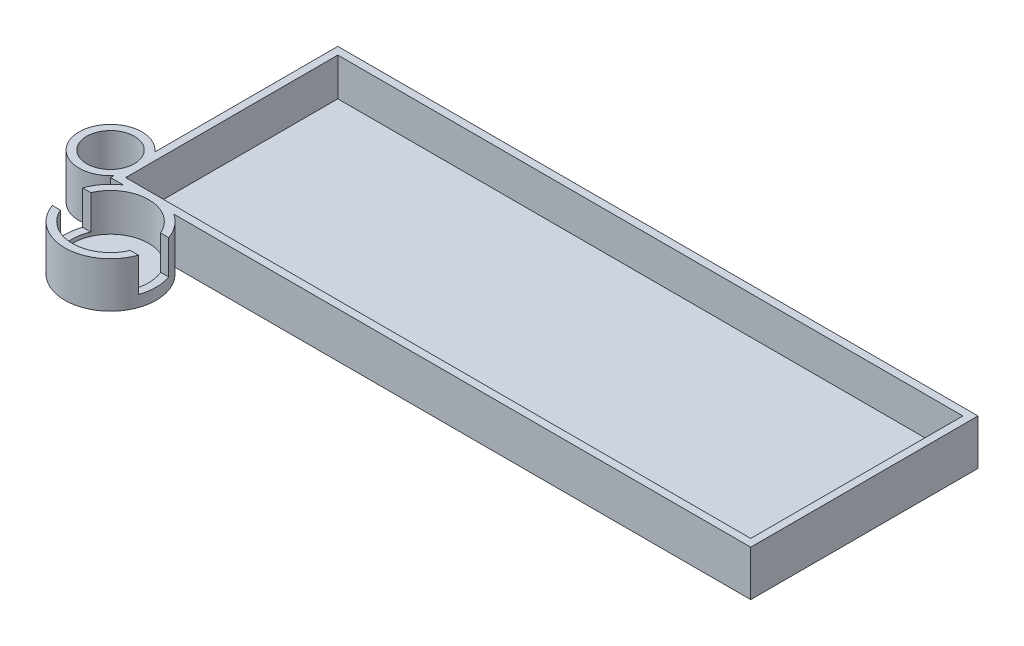
ISO-10303-21;
HEADER;
FILE_DESCRIPTION(('STEP AP214'),'2;1');
FILE_NAME('part.step','',(''),(''),'','','');
FILE_SCHEMA(('AUTOMOTIVE_DESIGN { 1 0 10303 214 1 1 1 1 }'));
ENDSEC;
DATA;
#1=APPLICATION_CONTEXT('core data for automotive mechanical design processes');
#2=APPLICATION_PROTOCOL_DEFINITION('international standard','automotive_design',2000,#1);
#3=PRODUCT_CONTEXT('',#1,'mechanical');
#4=PRODUCT('Part','Part','',(#3));
#5=PRODUCT_RELATED_PRODUCT_CATEGORY('part','',(#4));
#6=PRODUCT_DEFINITION_FORMATION('','',#4);
#7=PRODUCT_DEFINITION_CONTEXT('part definition',#1,'design');
#8=PRODUCT_DEFINITION('design','',#6,#7);
#9=PRODUCT_DEFINITION_SHAPE('','',#8);
#10=(LENGTH_UNIT() NAMED_UNIT(*) SI_UNIT(.MILLI.,.METRE.));
#11=(NAMED_UNIT(*) PLANE_ANGLE_UNIT() SI_UNIT($,.RADIAN.));
#12=(NAMED_UNIT(*) SI_UNIT($,.STERADIAN.) SOLID_ANGLE_UNIT());
#13=UNCERTAINTY_MEASURE_WITH_UNIT(LENGTH_MEASURE(1.E-05),#10,'distance_accuracy_value','');
#14=(GEOMETRIC_REPRESENTATION_CONTEXT(3) GLOBAL_UNCERTAINTY_ASSIGNED_CONTEXT((#13)) GLOBAL_UNIT_ASSIGNED_CONTEXT((#10,
#11,#12)) REPRESENTATION_CONTEXT('',''));
#15=CARTESIAN_POINT('',(0.,0.,0.));
#16=DIRECTION('',(0.,0.,1.));
#17=DIRECTION('',(1.,0.,0.));
#18=AXIS2_PLACEMENT_3D('',#15,#16,#17);
#19=CARTESIAN_POINT('',(-8.29999999999999,12.,51.7));
#20=DIRECTION('',(0.,-1.,0.));
#21=DIRECTION('',(0.,0.,-1.));
#22=AXIS2_PLACEMENT_3D('',#19,#20,#21);
#23=CYLINDRICAL_SURFACE('',#22,6.3);
#24=CARTESIAN_POINT('',(-8.29999999999999,12.,51.7));
#25=DIRECTION('',(0.,-1.,0.));
#26=DIRECTION('',(0.,0.,-1.));
#27=AXIS2_PLACEMENT_3D('',#24,#25,#26);
#28=CIRCLE('',#27,6.3);
#29=CARTESIAN_POINT('',(-8.29999999999999,12.,45.4));
#30=VERTEX_POINT('',#29);
#31=EDGE_CURVE('E194',#30,#30,#28,.T.);
#32=ORIENTED_EDGE('',*,*,#31,.F.);
#33=EDGE_LOOP('',(#32));
#34=FACE_BOUND('',#33,.T.);
#35=CARTESIAN_POINT('',(-8.29999999999999,2.,51.7));
#36=DIRECTION('',(0.,-1.,0.));
#37=DIRECTION('',(0.,0.,-1.));
#38=AXIS2_PLACEMENT_3D('',#35,#36,#37);
#39=CIRCLE('',#38,6.3);
#40=CARTESIAN_POINT('',(-8.29999999999999,2.,45.4));
#41=VERTEX_POINT('',#40);
#42=EDGE_CURVE('E11',#41,#41,#39,.F.);
#43=ORIENTED_EDGE('',*,*,#42,.F.);
#44=EDGE_LOOP('',(#43));
#45=FACE_BOUND('',#44,.T.);
#46=ADVANCED_FACE('F45',(#34,#45),#23,.F.);
#47=CARTESIAN_POINT('',(-1.99999999999999,12.,58.));
#48=DIRECTION('',(-1.,0.,0.));
#49=DIRECTION('',(0.,0.,1.));
#50=AXIS2_PLACEMENT_3D('',#47,#48,#49);
#51=PLANE('',#50);
#52=DIRECTION('',(0.,-1.,0.));
#53=VECTOR('',#52,1.);
#54=CARTESIAN_POINT('',(-1.99999999999999,12.,46.2962975655575));
#55=LINE('',#54,#53);
#56=CARTESIAN_POINT('',(-1.99999999999999,12.,46.2962975655575));
#57=VERTEX_POINT('',#56);
#58=CARTESIAN_POINT('',(-1.99999999999999,0.,46.2962975655575));
#59=VERTEX_POINT('',#58);
#60=EDGE_CURVE('E185',#57,#59,#55,.T.);
#61=ORIENTED_EDGE('',*,*,#60,.F.);
#62=DIRECTION('',(0.,0.,-1.));
#63=VECTOR('',#62,1.);
#64=CARTESIAN_POINT('',(-1.99999999999999,12.,58.));
#65=LINE('',#64,#63);
#66=CARTESIAN_POINT('',(-1.99999999999999,12.,-2.));
#67=VERTEX_POINT('',#66);
#68=EDGE_CURVE('E200',#57,#67,#65,.T.);
#69=ORIENTED_EDGE('',*,*,#68,.T.);
#70=DIRECTION('',(0.,-1.,0.));
#71=VECTOR('',#70,1.);
#72=CARTESIAN_POINT('',(-1.99999999999999,12.,-2.));
#73=LINE('',#72,#71);
#74=CARTESIAN_POINT('',(-1.99999999999999,0.,-2.));
#75=VERTEX_POINT('',#74);
#76=EDGE_CURVE('E253',#67,#75,#73,.T.);
#77=ORIENTED_EDGE('',*,*,#76,.T.);
#78=DIRECTION('',(0.,0.,-1.));
#79=VECTOR('',#78,1.);
#80=CARTESIAN_POINT('',(-1.99999999999999,0.,58.));
#81=LINE('',#80,#79);
#82=EDGE_CURVE('E202',#59,#75,#81,.T.);
#83=ORIENTED_EDGE('',*,*,#82,.F.);
#84=EDGE_LOOP('',(#61,#69,#77,#83));
#85=FACE_BOUND('',#84,.T.);
#86=ADVANCED_FACE('F198',(#85),#51,.T.);
#87=CARTESIAN_POINT('',(0.,12.,0.));
#88=DIRECTION('',(0.,1.,0.));
#89=DIRECTION('',(0.,0.,1.));
#90=AXIS2_PLACEMENT_3D('',#87,#88,#89);
#91=PLANE('',#90);
#92=DIRECTION('',(1.,0.,0.));
#93=VECTOR('',#92,1.);
#94=CARTESIAN_POINT('',(31.2664857365085,12.,72.05));
#95=LINE('',#94,#93);
#96=CARTESIAN_POINT('',(-3.31672776132163,12.,72.05));
#97=VERTEX_POINT('',#96);
#98=CARTESIAN_POINT('',(-1.1696800378321,12.,72.05));
#99=VERTEX_POINT('',#98);
#100=EDGE_CURVE('E295',#97,#99,#95,.T.);
#101=ORIENTED_EDGE('',*,*,#100,.F.);
#102=CARTESIAN_POINT('',(8.05000000000001,12.,68.05));
#103=DIRECTION('',(0.,-1.,0.));
#104=DIRECTION('',(0.,0.,-1.));
#105=AXIS2_PLACEMENT_3D('',#102,#103,#104);
#106=CIRCLE('',#105,12.05);
#107=CARTESIAN_POINT('',(19.4167277613216,12.,72.05));
#108=VERTEX_POINT('',#107);
#109=EDGE_CURVE('E307',#108,#97,#106,.T.);
#110=ORIENTED_EDGE('',*,*,#109,.F.);
#111=CARTESIAN_POINT('',(17.2696800378321,12.,72.05));
#112=VERTEX_POINT('',#111);
#113=EDGE_CURVE('E311',#112,#108,#95,.T.);
#114=ORIENTED_EDGE('',*,*,#113,.F.);
#115=CARTESIAN_POINT('',(8.05000000000001,12.,68.05));
#116=DIRECTION('',(0.,-1.,0.));
#117=DIRECTION('',(0.,0.,-1.));
#118=AXIS2_PLACEMENT_3D('',#115,#116,#117);
#119=CIRCLE('',#118,10.05);
#120=EDGE_CURVE('E309',#112,#99,#119,.T.);
#121=ORIENTED_EDGE('',*,*,#120,.T.);
#122=EDGE_LOOP('',(#101,#110,#114,#121));
#123=FACE_BOUND('',#122,.T.);
#124=ADVANCED_FACE('F305',(#123),#91,.T.);
#125=CARTESIAN_POINT('',(8.05000000000001,12.,68.05));
#126=DIRECTION('',(0.,-1.,0.));
#127=DIRECTION('',(0.,0.,-1.));
#128=AXIS2_PLACEMENT_3D('',#125,#126,#127);
#129=CYLINDRICAL_SURFACE('',#128,10.05);
#130=CARTESIAN_POINT('',(8.05000000000001,3.,68.05));
#131=DIRECTION('',(0.,1.,0.));
#132=DIRECTION('',(0.,0.,1.));
#133=AXIS2_PLACEMENT_3D('',#130,#131,#132);
#134=CIRCLE('',#133,10.05);
#135=CARTESIAN_POINT('',(-1.1696800378321,3.,72.05));
#136=VERTEX_POINT('',#135);
#137=CARTESIAN_POINT('',(-1.16968003783211,3.,64.05));
#138=VERTEX_POINT('',#137);
#139=EDGE_CURVE('E466',#136,#138,#134,.F.);
#140=ORIENTED_EDGE('',*,*,#139,.F.);
#141=DIRECTION('',(0.,-1.,0.));
#142=VECTOR('',#141,1.);
#143=CARTESIAN_POINT('',(-1.1696800378321,12.,72.05));
#144=LINE('',#143,#142);
#145=EDGE_CURVE('E478',#136,#99,#144,.F.);
#146=ORIENTED_EDGE('',*,*,#145,.T.);
#147=ORIENTED_EDGE('',*,*,#120,.F.);
#148=DIRECTION('',(0.,-1.,0.));
#149=VECTOR('',#148,1.);
#150=CARTESIAN_POINT('',(17.2696800378321,12.,72.05));
#151=LINE('',#150,#149);
#152=CARTESIAN_POINT('',(17.2696800378321,3.,72.05));
#153=VERTEX_POINT('',#152);
#154=EDGE_CURVE('E475',#112,#153,#151,.T.);
#155=ORIENTED_EDGE('',*,*,#154,.T.);
#156=CARTESIAN_POINT('',(17.2696800378321,3.,64.05));
#157=VERTEX_POINT('',#156);
#158=EDGE_CURVE('E463',#157,#153,#134,.F.);
#159=ORIENTED_EDGE('',*,*,#158,.F.);
#160=DIRECTION('',(0.,-1.,0.));
#161=VECTOR('',#160,1.);
#162=CARTESIAN_POINT('',(17.2696800378321,12.,64.05));
#163=LINE('',#162,#161);
#164=CARTESIAN_POINT('',(17.2696800378321,12.,64.05));
#165=VERTEX_POINT('',#164);
#166=EDGE_CURVE('E471',#157,#165,#163,.F.);
#167=ORIENTED_EDGE('',*,*,#166,.T.);
#168=CARTESIAN_POINT('',(-1.16968003783211,12.,64.05));
#169=VERTEX_POINT('',#168);
#170=EDGE_CURVE('E326',#169,#165,#119,.T.);
#171=ORIENTED_EDGE('',*,*,#170,.F.);
#172=DIRECTION('',(0.,-1.,0.));
#173=VECTOR('',#172,1.);
#174=CARTESIAN_POINT('',(-1.16968003783211,12.,64.05));
#175=LINE('',#174,#173);
#176=EDGE_CURVE('E467',#169,#138,#175,.T.);
#177=ORIENTED_EDGE('',*,*,#176,.T.);
#178=EDGE_LOOP('',(#140,#146,#147,#155,#159,#167,#171,#177));
#179=FACE_BOUND('',#178,.T.);
#180=CARTESIAN_POINT('',(8.05000000000001,2.,68.05));
#181=DIRECTION('',(0.,-1.,0.));
#182=DIRECTION('',(0.,0.,-1.));
#183=AXIS2_PLACEMENT_3D('',#180,#181,#182);
#184=CIRCLE('',#183,10.05);
#185=CARTESIAN_POINT('',(8.05000000000001,2.,58.));
#186=VERTEX_POINT('',#185);
#187=EDGE_CURVE('E272',#186,#186,#184,.F.);
#188=ORIENTED_EDGE('',*,*,#187,.F.);
#189=EDGE_LOOP('',(#188));
#190=FACE_BOUND('',#189,.T.);
#191=ADVANCED_FACE('F398',(#179,#190),#129,.F.);
#192=CARTESIAN_POINT('',(-1.99999999999999,12.,58.));
#193=DIRECTION('',(0.,0.,1.));
#194=DIRECTION('',(1.,0.,0.));
#195=AXIS2_PLACEMENT_3D('',#192,#193,#194);
#196=PLANE('',#195);
#197=DIRECTION('',(0.,-1.,0.));
#198=VECTOR('',#197,1.);
#199=CARTESIAN_POINT('',(14.6983080554379,12.,58.));
#200=LINE('',#199,#198);
#201=CARTESIAN_POINT('',(14.6983080554379,0.,58.));
#202=VERTEX_POINT('',#201);
#203=CARTESIAN_POINT('',(14.6983080554379,12.,58.));
#204=VERTEX_POINT('',#203);
#205=EDGE_CURVE('E322',#202,#204,#200,.F.);
#206=ORIENTED_EDGE('',*,*,#205,.F.);
#207=DIRECTION('',(-1.,0.,0.));
#208=VECTOR('',#207,1.);
#209=CARTESIAN_POINT('',(-1.99999999999999,0.,58.));
#210=LINE('',#209,#208);
#211=CARTESIAN_POINT('',(167.,0.,58.));
#212=VERTEX_POINT('',#211);
#213=EDGE_CURVE('E229',#212,#202,#210,.T.);
#214=ORIENTED_EDGE('',*,*,#213,.F.);
#215=DIRECTION('',(0.,-1.,0.));
#216=VECTOR('',#215,1.);
#217=CARTESIAN_POINT('',(167.,12.,58.));
#218=LINE('',#217,#216);
#219=CARTESIAN_POINT('',(167.,12.,58.));
#220=VERTEX_POINT('',#219);
#221=EDGE_CURVE('E246',#220,#212,#218,.T.);
#222=ORIENTED_EDGE('',*,*,#221,.F.);
#223=DIRECTION('',(-1.,0.,0.));
#224=VECTOR('',#223,1.);
#225=CARTESIAN_POINT('',(-1.99999999999999,12.,58.));
#226=LINE('',#225,#224);
#227=EDGE_CURVE('E213',#220,#204,#226,.T.);
#228=ORIENTED_EDGE('',*,*,#227,.T.);
#229=EDGE_LOOP('',(#206,#214,#222,#228));
#230=FACE_BOUND('',#229,.T.);
#231=ADVANCED_FACE('F428',(#230),#196,.T.);
#232=CARTESIAN_POINT('',(0.,2.,0.));
#233=DIRECTION('',(0.,1.,0.));
#234=DIRECTION('',(0.,0.,1.));
#235=AXIS2_PLACEMENT_3D('',#232,#233,#234);
#236=PLANE('',#235);
#237=DIRECTION('',(0.,0.,1.));
#238=VECTOR('',#237,1.);
#239=CARTESIAN_POINT('',(0.,2.,0.));
#240=LINE('',#239,#238);
#241=CARTESIAN_POINT('',(0.,2.,0.));
#242=VERTEX_POINT('',#241);
#243=CARTESIAN_POINT('',(0.,2.,56.));
#244=VERTEX_POINT('',#243);
#245=EDGE_CURVE('E249',#242,#244,#240,.T.);
#246=ORIENTED_EDGE('',*,*,#245,.T.);
#247=DIRECTION('',(1.,0.,0.));
#248=VECTOR('',#247,1.);
#249=CARTESIAN_POINT('',(0.,2.,56.));
#250=LINE('',#249,#248);
#251=CARTESIAN_POINT('',(165.,2.,56.));
#252=VERTEX_POINT('',#251);
#253=EDGE_CURVE('E261',#244,#252,#250,.T.);
#254=ORIENTED_EDGE('',*,*,#253,.T.);
#255=DIRECTION('',(0.,0.,-1.));
#256=VECTOR('',#255,1.);
#257=CARTESIAN_POINT('',(165.,2.,0.));
#258=LINE('',#257,#256);
#259=CARTESIAN_POINT('',(165.,2.,0.));
#260=VERTEX_POINT('',#259);
#261=EDGE_CURVE('E264',#252,#260,#258,.T.);
#262=ORIENTED_EDGE('',*,*,#261,.T.);
#263=DIRECTION('',(-1.,0.,0.));
#264=VECTOR('',#263,1.);
#265=CARTESIAN_POINT('',(0.,2.,0.));
#266=LINE('',#265,#264);
#267=EDGE_CURVE('E268',#260,#242,#266,.T.);
#268=ORIENTED_EDGE('',*,*,#267,.T.);
#269=EDGE_LOOP('',(#246,#254,#262,#268));
#270=FACE_BOUND('',#269,.T.);
#271=ADVANCED_FACE('F375',(#270),#236,.T.);
#272=DIRECTION('',(0.,-1.,0.));
#273=VECTOR('',#272,1.);
#274=CARTESIAN_POINT('',(1.40169194456213,12.,58.));
#275=LINE('',#274,#273);
#276=CARTESIAN_POINT('',(1.40169194456213,12.,58.));
#277=VERTEX_POINT('',#276);
#278=CARTESIAN_POINT('',(1.40169194456213,0.,58.));
#279=VERTEX_POINT('',#278);
#280=EDGE_CURVE('E333',#277,#279,#275,.T.);
#281=ORIENTED_EDGE('',*,*,#280,.F.);
#282=CARTESIAN_POINT('',(-1.99999999999999,12.,58.));
#283=VERTEX_POINT('',#282);
#284=EDGE_CURVE('E218',#277,#283,#226,.T.);
#285=ORIENTED_EDGE('',*,*,#284,.T.);
#286=DIRECTION('',(0.,-1.,0.));
#287=VECTOR('',#286,1.);
#288=CARTESIAN_POINT('',(-1.99999999999999,12.,58.));
#289=LINE('',#288,#287);
#290=CARTESIAN_POINT('',(-1.99999999999999,0.,58.));
#291=VERTEX_POINT('',#290);
#292=EDGE_CURVE('E228',#283,#291,#289,.T.);
#293=ORIENTED_EDGE('',*,*,#292,.T.);
#294=EDGE_CURVE('E233',#279,#291,#210,.T.);
#295=ORIENTED_EDGE('',*,*,#294,.F.);
#296=EDGE_LOOP('',(#281,#285,#293,#295));
#297=FACE_BOUND('',#296,.T.);
#298=ADVANCED_FACE('F509',(#297),#196,.T.);
#299=CARTESIAN_POINT('',(167.,12.,58.));
#300=DIRECTION('',(1.,0.,0.));
#301=DIRECTION('',(0.,0.,-1.));
#302=AXIS2_PLACEMENT_3D('',#299,#300,#301);
#303=PLANE('',#302);
#304=DIRECTION('',(0.,0.,1.));
#305=VECTOR('',#304,1.);
#306=CARTESIAN_POINT('',(167.,0.,58.));
#307=LINE('',#306,#305);
#308=CARTESIAN_POINT('',(167.,0.,-2.));
#309=VERTEX_POINT('',#308);
#310=EDGE_CURVE('E242',#309,#212,#307,.T.);
#311=ORIENTED_EDGE('',*,*,#310,.F.);
#312=DIRECTION('',(0.,-1.,0.));
#313=VECTOR('',#312,1.);
#314=CARTESIAN_POINT('',(167.,12.,-2.));
#315=LINE('',#314,#313);
#316=CARTESIAN_POINT('',(167.,12.,-2.));
#317=VERTEX_POINT('',#316);
#318=EDGE_CURVE('E250',#317,#309,#315,.T.);
#319=ORIENTED_EDGE('',*,*,#318,.F.);
#320=DIRECTION('',(0.,0.,1.));
#321=VECTOR('',#320,1.);
#322=CARTESIAN_POINT('',(167.,12.,58.));
#323=LINE('',#322,#321);
#324=EDGE_CURVE('E224',#317,#220,#323,.T.);
#325=ORIENTED_EDGE('',*,*,#324,.T.);
#326=ORIENTED_EDGE('',*,*,#221,.T.);
#327=EDGE_LOOP('',(#311,#319,#325,#326));
#328=FACE_BOUND('',#327,.T.);
#329=ADVANCED_FACE('F511',(#328),#303,.T.);
#330=CARTESIAN_POINT('',(-1.99999999999999,12.,-2.));
#331=DIRECTION('',(0.,0.,-1.));
#332=DIRECTION('',(-1.,0.,0.));
#333=AXIS2_PLACEMENT_3D('',#330,#331,#332);
#334=PLANE('',#333);
#335=DIRECTION('',(1.,0.,0.));
#336=VECTOR('',#335,1.);
#337=CARTESIAN_POINT('',(-1.99999999999999,0.,-2.));
#338=LINE('',#337,#336);
#339=EDGE_CURVE('E238',#75,#309,#338,.T.);
#340=ORIENTED_EDGE('',*,*,#339,.F.);
#341=ORIENTED_EDGE('',*,*,#76,.F.);
#342=DIRECTION('',(1.,0.,0.));
#343=VECTOR('',#342,1.);
#344=CARTESIAN_POINT('',(-1.99999999999999,12.,-2.));
#345=LINE('',#344,#343);
#346=EDGE_CURVE('E210',#67,#317,#345,.T.);
#347=ORIENTED_EDGE('',*,*,#346,.T.);
#348=ORIENTED_EDGE('',*,*,#318,.T.);
#349=EDGE_LOOP('',(#340,#341,#347,#348));
#350=FACE_BOUND('',#349,.T.);
#351=ADVANCED_FACE('F392',(#350),#334,.T.);
#352=DIRECTION('',(0.,-1.,0.));
#353=VECTOR('',#352,1.);
#354=CARTESIAN_POINT('',(-1.99999999999999,12.,57.1037024344425));
#355=LINE('',#354,#353);
#356=CARTESIAN_POINT('',(-1.99999999999999,0.,57.1037024344425));
#357=VERTEX_POINT('',#356);
#358=CARTESIAN_POINT('',(-1.99999999999999,12.,57.1037024344425));
#359=VERTEX_POINT('',#358);
#360=EDGE_CURVE('E188',#357,#359,#355,.F.);
#361=ORIENTED_EDGE('',*,*,#360,.F.);
#362=EDGE_CURVE('E234',#291,#357,#81,.T.);
#363=ORIENTED_EDGE('',*,*,#362,.F.);
#364=ORIENTED_EDGE('',*,*,#292,.F.);
#365=EDGE_CURVE('E212',#283,#359,#65,.T.);
#366=ORIENTED_EDGE('',*,*,#365,.T.);
#367=EDGE_LOOP('',(#361,#363,#364,#366));
#368=FACE_BOUND('',#367,.T.);
#369=ADVANCED_FACE('F384',(#368),#51,.T.);
#370=ORIENTED_EDGE('',*,*,#31,.T.);
#371=EDGE_LOOP('',(#370));
#372=FACE_BOUND('',#371,.T.);
#373=DIRECTION('',(0.,0.,-1.));
#374=VECTOR('',#373,1.);
#375=CARTESIAN_POINT('',(0.,12.,56.));
#376=LINE('',#375,#374);
#377=CARTESIAN_POINT('',(0.,12.,56.));
#378=VERTEX_POINT('',#377);
#379=CARTESIAN_POINT('',(0.,12.,0.));
#380=VERTEX_POINT('',#379);
#381=EDGE_CURVE('E336',#378,#380,#376,.T.);
#382=ORIENTED_EDGE('',*,*,#381,.T.);
#383=DIRECTION('',(1.,0.,0.));
#384=VECTOR('',#383,1.);
#385=CARTESIAN_POINT('',(0.,12.,0.));
#386=LINE('',#385,#384);
#387=CARTESIAN_POINT('',(165.,12.,0.));
#388=VERTEX_POINT('',#387);
#389=EDGE_CURVE('E339',#380,#388,#386,.T.);
#390=ORIENTED_EDGE('',*,*,#389,.T.);
#391=DIRECTION('',(0.,0.,1.));
#392=VECTOR('',#391,1.);
#393=CARTESIAN_POINT('',(165.,12.,56.));
#394=LINE('',#393,#392);
#395=CARTESIAN_POINT('',(165.,12.,56.));
#396=VERTEX_POINT('',#395);
#397=EDGE_CURVE('E343',#388,#396,#394,.T.);
#398=ORIENTED_EDGE('',*,*,#397,.T.);
#399=DIRECTION('',(-1.,0.,0.));
#400=VECTOR('',#399,1.);
#401=CARTESIAN_POINT('',(0.,12.,56.));
#402=LINE('',#401,#400);
#403=EDGE_CURVE('E347',#396,#378,#402,.T.);
#404=ORIENTED_EDGE('',*,*,#403,.T.);
#405=EDGE_LOOP('',(#382,#390,#398,#404));
#406=FACE_BOUND('',#405,.T.);
#407=ORIENTED_EDGE('',*,*,#68,.F.);
#408=CARTESIAN_POINT('',(-8.29999999999999,12.,51.7));
#409=DIRECTION('',(0.,-1.,0.));
#410=DIRECTION('',(0.,0.,-1.));
#411=AXIS2_PLACEMENT_3D('',#408,#409,#410);
#412=CIRCLE('',#411,8.3);
#413=EDGE_CURVE('E182',#359,#57,#412,.T.);
#414=ORIENTED_EDGE('',*,*,#413,.F.);
#415=ORIENTED_EDGE('',*,*,#365,.F.);
#416=ORIENTED_EDGE('',*,*,#284,.F.);
#417=CARTESIAN_POINT('',(-3.31672776132163,12.,64.05));
#418=VERTEX_POINT('',#417);
#419=EDGE_CURVE('E317',#418,#277,#106,.T.);
#420=ORIENTED_EDGE('',*,*,#419,.F.);
#421=DIRECTION('',(-1.,0.,0.));
#422=VECTOR('',#421,1.);
#423=CARTESIAN_POINT('',(31.2664857365085,12.,64.05));
#424=LINE('',#423,#422);
#425=EDGE_CURVE('E204',#169,#418,#424,.T.);
#426=ORIENTED_EDGE('',*,*,#425,.F.);
#427=ORIENTED_EDGE('',*,*,#170,.T.);
#428=CARTESIAN_POINT('',(19.4167277613217,12.,64.05));
#429=VERTEX_POINT('',#428);
#430=EDGE_CURVE('E460',#429,#165,#424,.T.);
#431=ORIENTED_EDGE('',*,*,#430,.F.);
#432=EDGE_CURVE('E316',#204,#429,#106,.T.);
#433=ORIENTED_EDGE('',*,*,#432,.F.);
#434=ORIENTED_EDGE('',*,*,#227,.F.);
#435=ORIENTED_EDGE('',*,*,#324,.F.);
#436=ORIENTED_EDGE('',*,*,#346,.F.);
#437=EDGE_LOOP('',(#407,#414,#415,#416,#420,#426,#427,#431,#433,#434,#435,#436));
#438=FACE_BOUND('',#437,.T.);
#439=ADVANCED_FACE('F207',(#372,#406,#438),#91,.T.);
#440=CARTESIAN_POINT('',(0.,12.,56.));
#441=DIRECTION('',(-1.,0.,0.));
#442=DIRECTION('',(0.,0.,1.));
#443=AXIS2_PLACEMENT_3D('',#440,#441,#442);
#444=PLANE('',#443);
#445=DIRECTION('',(0.,-1.,0.));
#446=VECTOR('',#445,1.);
#447=CARTESIAN_POINT('',(0.,12.,0.));
#448=LINE('',#447,#446);
#449=EDGE_CURVE('E350',#380,#242,#448,.T.);
#450=ORIENTED_EDGE('',*,*,#449,.F.);
#451=ORIENTED_EDGE('',*,*,#381,.F.);
#452=DIRECTION('',(0.,-1.,0.));
#453=VECTOR('',#452,1.);
#454=CARTESIAN_POINT('',(0.,12.,56.));
#455=LINE('',#454,#453);
#456=EDGE_CURVE('E351',#378,#244,#455,.T.);
#457=ORIENTED_EDGE('',*,*,#456,.T.);
#458=ORIENTED_EDGE('',*,*,#245,.F.);
#459=EDGE_LOOP('',(#450,#451,#457,#458));
#460=FACE_BOUND('',#459,.T.);
#461=ADVANCED_FACE('F371',(#460),#444,.F.);
#462=CARTESIAN_POINT('',(0.,12.,56.));
#463=DIRECTION('',(0.,0.,1.));
#464=DIRECTION('',(1.,0.,0.));
#465=AXIS2_PLACEMENT_3D('',#462,#463,#464);
#466=PLANE('',#465);
#467=ORIENTED_EDGE('',*,*,#456,.F.);
#468=ORIENTED_EDGE('',*,*,#403,.F.);
#469=DIRECTION('',(0.,-1.,0.));
#470=VECTOR('',#469,1.);
#471=CARTESIAN_POINT('',(165.,12.,56.));
#472=LINE('',#471,#470);
#473=EDGE_CURVE('E355',#396,#252,#472,.T.);
#474=ORIENTED_EDGE('',*,*,#473,.T.);
#475=ORIENTED_EDGE('',*,*,#253,.F.);
#476=EDGE_LOOP('',(#467,#468,#474,#475));
#477=FACE_BOUND('',#476,.T.);
#478=ADVANCED_FACE('F381',(#477),#466,.F.);
#479=CARTESIAN_POINT('',(165.,12.,56.));
#480=DIRECTION('',(1.,0.,0.));
#481=DIRECTION('',(0.,0.,-1.));
#482=AXIS2_PLACEMENT_3D('',#479,#480,#481);
#483=PLANE('',#482);
#484=ORIENTED_EDGE('',*,*,#261,.F.);
#485=ORIENTED_EDGE('',*,*,#473,.F.);
#486=ORIENTED_EDGE('',*,*,#397,.F.);
#487=DIRECTION('',(0.,-1.,0.));
#488=VECTOR('',#487,1.);
#489=CARTESIAN_POINT('',(165.,12.,0.));
#490=LINE('',#489,#488);
#491=EDGE_CURVE('E359',#388,#260,#490,.T.);
#492=ORIENTED_EDGE('',*,*,#491,.T.);
#493=EDGE_LOOP('',(#484,#485,#486,#492));
#494=FACE_BOUND('',#493,.T.);
#495=ADVANCED_FACE('F378',(#494),#483,.F.);
#496=CARTESIAN_POINT('',(0.,12.,0.));
#497=DIRECTION('',(0.,0.,-1.));
#498=DIRECTION('',(-1.,0.,0.));
#499=AXIS2_PLACEMENT_3D('',#496,#497,#498);
#500=PLANE('',#499);
#501=ORIENTED_EDGE('',*,*,#267,.F.);
#502=ORIENTED_EDGE('',*,*,#491,.F.);
#503=ORIENTED_EDGE('',*,*,#389,.F.);
#504=ORIENTED_EDGE('',*,*,#449,.T.);
#505=EDGE_LOOP('',(#501,#502,#503,#504));
#506=FACE_BOUND('',#505,.T.);
#507=ADVANCED_FACE('F367',(#506),#500,.F.);
#508=CARTESIAN_POINT('',(0.,0.,0.));
#509=DIRECTION('',(0.,1.,0.));
#510=DIRECTION('',(0.,0.,1.));
#511=AXIS2_PLACEMENT_3D('',#508,#509,#510);
#512=PLANE('',#511);
#513=CARTESIAN_POINT('',(-8.29999999999999,0.,51.7));
#514=DIRECTION('',(0.,-1.,0.));
#515=DIRECTION('',(0.,0.,-1.));
#516=AXIS2_PLACEMENT_3D('',#513,#514,#515);
#517=CIRCLE('',#516,8.3);
#518=EDGE_CURVE('E445',#357,#59,#517,.T.);
#519=ORIENTED_EDGE('',*,*,#518,.T.);
#520=ORIENTED_EDGE('',*,*,#82,.T.);
#521=ORIENTED_EDGE('',*,*,#339,.T.);
#522=ORIENTED_EDGE('',*,*,#310,.T.);
#523=ORIENTED_EDGE('',*,*,#213,.T.);
#524=CARTESIAN_POINT('',(8.05000000000001,0.,68.05));
#525=DIRECTION('',(0.,-1.,0.));
#526=DIRECTION('',(0.,0.,-1.));
#527=AXIS2_PLACEMENT_3D('',#524,#525,#526);
#528=CIRCLE('',#527,12.05);
#529=EDGE_CURVE('E323',#202,#279,#528,.T.);
#530=ORIENTED_EDGE('',*,*,#529,.T.);
#531=ORIENTED_EDGE('',*,*,#294,.T.);
#532=ORIENTED_EDGE('',*,*,#362,.T.);
#533=EDGE_LOOP('',(#519,#520,#521,#522,#523,#530,#531,#532));
#534=FACE_BOUND('',#533,.T.);
#535=ADVANCED_FACE('F47',(#534),#512,.F.);
#536=CARTESIAN_POINT('',(8.05000000000001,12.,68.05));
#537=DIRECTION('',(0.,-1.,0.));
#538=DIRECTION('',(0.,0.,-1.));
#539=AXIS2_PLACEMENT_3D('',#536,#537,#538);
#540=CYLINDRICAL_SURFACE('',#539,12.05);
#541=DIRECTION('',(0.,-1.,0.));
#542=VECTOR('',#541,1.);
#543=CARTESIAN_POINT('',(-3.31672776132163,12.,72.05));
#544=LINE('',#543,#542);
#545=CARTESIAN_POINT('',(-3.31672776132163,3.,72.05));
#546=VERTEX_POINT('',#545);
#547=EDGE_CURVE('E54',#546,#97,#544,.F.);
#548=ORIENTED_EDGE('',*,*,#547,.F.);
#549=CARTESIAN_POINT('',(8.05000000000001,3.,68.05));
#550=DIRECTION('',(0.,1.,0.));
#551=DIRECTION('',(0.,0.,1.));
#552=AXIS2_PLACEMENT_3D('',#549,#550,#551);
#553=CIRCLE('',#552,12.05);
#554=CARTESIAN_POINT('',(-3.31672776132163,3.,64.05));
#555=VERTEX_POINT('',#554);
#556=EDGE_CURVE('E281',#546,#555,#553,.F.);
#557=ORIENTED_EDGE('',*,*,#556,.T.);
#558=DIRECTION('',(0.,-1.,0.));
#559=VECTOR('',#558,1.);
#560=CARTESIAN_POINT('',(-3.31672776132163,12.,64.05));
#561=LINE('',#560,#559);
#562=EDGE_CURVE('E287',#418,#555,#561,.T.);
#563=ORIENTED_EDGE('',*,*,#562,.F.);
#564=ORIENTED_EDGE('',*,*,#419,.T.);
#565=ORIENTED_EDGE('',*,*,#280,.T.);
#566=ORIENTED_EDGE('',*,*,#529,.F.);
#567=ORIENTED_EDGE('',*,*,#205,.T.);
#568=ORIENTED_EDGE('',*,*,#432,.T.);
#569=DIRECTION('',(0.,-1.,0.));
#570=VECTOR('',#569,1.);
#571=CARTESIAN_POINT('',(19.4167277613217,12.,64.05));
#572=LINE('',#571,#570);
#573=CARTESIAN_POINT('',(19.4167277613217,3.,64.05));
#574=VERTEX_POINT('',#573);
#575=EDGE_CURVE('E280',#574,#429,#572,.F.);
#576=ORIENTED_EDGE('',*,*,#575,.F.);
#577=CARTESIAN_POINT('',(19.4167277613216,3.,72.05));
#578=VERTEX_POINT('',#577);
#579=EDGE_CURVE('E276',#574,#578,#553,.F.);
#580=ORIENTED_EDGE('',*,*,#579,.T.);
#581=DIRECTION('',(0.,-1.,0.));
#582=VECTOR('',#581,1.);
#583=CARTESIAN_POINT('',(19.4167277613216,12.,72.05));
#584=LINE('',#583,#582);
#585=EDGE_CURVE('E284',#108,#578,#584,.T.);
#586=ORIENTED_EDGE('',*,*,#585,.F.);
#587=ORIENTED_EDGE('',*,*,#109,.T.);
#588=EDGE_LOOP('',(#548,#557,#563,#564,#565,#566,#567,#568,#576,#580,#586,#587));
#589=FACE_BOUND('',#588,.T.);
#590=ADVANCED_FACE('F314',(#589),#540,.T.);
#591=CARTESIAN_POINT('',(8.05000000000001,2.,68.05));
#592=DIRECTION('',(0.,-1.,0.));
#593=DIRECTION('',(0.,0.,-1.));
#594=AXIS2_PLACEMENT_3D('',#591,#592,#593);
#595=PLANE('',#594);
#596=ORIENTED_EDGE('',*,*,#187,.T.);
#597=EDGE_LOOP('',(#596));
#598=FACE_BOUND('',#597,.T.);
#599=ADVANCED_FACE('F422',(#598),#595,.F.);
#600=CARTESIAN_POINT('',(0.,3.,0.));
#601=DIRECTION('',(0.,1.,0.));
#602=DIRECTION('',(0.,0.,1.));
#603=AXIS2_PLACEMENT_3D('',#600,#601,#602);
#604=PLANE('',#603);
#605=ORIENTED_EDGE('',*,*,#158,.T.);
#606=DIRECTION('',(1.,0.,0.));
#607=VECTOR('',#606,1.);
#608=CARTESIAN_POINT('',(31.2664857365085,3.,72.05));
#609=LINE('',#608,#607);
#610=EDGE_CURVE('E69',#153,#578,#609,.T.);
#611=ORIENTED_EDGE('',*,*,#610,.T.);
#612=ORIENTED_EDGE('',*,*,#579,.F.);
#613=DIRECTION('',(-1.,0.,0.));
#614=VECTOR('',#613,1.);
#615=CARTESIAN_POINT('',(31.2664857365085,3.,64.05));
#616=LINE('',#615,#614);
#617=EDGE_CURVE('E456',#574,#157,#616,.T.);
#618=ORIENTED_EDGE('',*,*,#617,.T.);
#619=EDGE_LOOP('',(#605,#611,#612,#618));
#620=FACE_BOUND('',#619,.T.);
#621=ADVANCED_FACE('F414',(#620),#604,.T.);
#622=CARTESIAN_POINT('',(31.2664857365085,3.,64.05));
#623=DIRECTION('',(0.,0.,-1.));
#624=DIRECTION('',(-1.,0.,0.));
#625=AXIS2_PLACEMENT_3D('',#622,#623,#624);
#626=PLANE('',#625);
#627=ORIENTED_EDGE('',*,*,#617,.F.);
#628=ORIENTED_EDGE('',*,*,#575,.T.);
#629=ORIENTED_EDGE('',*,*,#430,.T.);
#630=ORIENTED_EDGE('',*,*,#166,.F.);
#631=EDGE_LOOP('',(#627,#628,#629,#630));
#632=FACE_BOUND('',#631,.T.);
#633=ADVANCED_FACE('F418',(#632),#626,.F.);
#634=CARTESIAN_POINT('',(31.2664857365085,3.,72.05));
#635=DIRECTION('',(0.,0.,1.));
#636=DIRECTION('',(1.,0.,0.));
#637=AXIS2_PLACEMENT_3D('',#634,#635,#636);
#638=PLANE('',#637);
#639=ORIENTED_EDGE('',*,*,#113,.T.);
#640=ORIENTED_EDGE('',*,*,#585,.T.);
#641=ORIENTED_EDGE('',*,*,#610,.F.);
#642=ORIENTED_EDGE('',*,*,#154,.F.);
#643=EDGE_LOOP('',(#639,#640,#641,#642));
#644=FACE_BOUND('',#643,.T.);
#645=ADVANCED_FACE('F417',(#644),#638,.F.);
#646=EDGE_CURVE('E298',#546,#136,#609,.T.);
#647=ORIENTED_EDGE('',*,*,#646,.F.);
#648=ORIENTED_EDGE('',*,*,#547,.T.);
#649=ORIENTED_EDGE('',*,*,#100,.T.);
#650=ORIENTED_EDGE('',*,*,#145,.F.);
#651=EDGE_LOOP('',(#647,#648,#649,#650));
#652=FACE_BOUND('',#651,.T.);
#653=ADVANCED_FACE('F294',(#652),#638,.F.);
#654=ORIENTED_EDGE('',*,*,#425,.T.);
#655=ORIENTED_EDGE('',*,*,#562,.T.);
#656=EDGE_CURVE('E61',#138,#555,#616,.T.);
#657=ORIENTED_EDGE('',*,*,#656,.F.);
#658=ORIENTED_EDGE('',*,*,#176,.F.);
#659=EDGE_LOOP('',(#654,#655,#657,#658));
#660=FACE_BOUND('',#659,.T.);
#661=ADVANCED_FACE('F413',(#660),#626,.F.);
#662=ORIENTED_EDGE('',*,*,#139,.T.);
#663=ORIENTED_EDGE('',*,*,#656,.T.);
#664=ORIENTED_EDGE('',*,*,#556,.F.);
#665=ORIENTED_EDGE('',*,*,#646,.T.);
#666=EDGE_LOOP('',(#662,#663,#664,#665));
#667=FACE_BOUND('',#666,.T.);
#668=ADVANCED_FACE('F411',(#667),#604,.T.);
#669=CARTESIAN_POINT('',(-8.29999999999999,12.,51.7));
#670=DIRECTION('',(0.,-1.,0.));
#671=DIRECTION('',(0.,0.,-1.));
#672=AXIS2_PLACEMENT_3D('',#669,#670,#671);
#673=CYLINDRICAL_SURFACE('',#672,8.3);
#674=ORIENTED_EDGE('',*,*,#413,.T.);
#675=ORIENTED_EDGE('',*,*,#60,.T.);
#676=ORIENTED_EDGE('',*,*,#518,.F.);
#677=ORIENTED_EDGE('',*,*,#360,.T.);
#678=EDGE_LOOP('',(#674,#675,#676,#677));
#679=FACE_BOUND('',#678,.T.);
#680=ADVANCED_FACE('F184',(#679),#673,.T.);
#681=CARTESIAN_POINT('',(-8.29999999999999,2.,51.7));
#682=DIRECTION('',(0.,-1.,0.));
#683=DIRECTION('',(0.,0.,-1.));
#684=AXIS2_PLACEMENT_3D('',#681,#682,#683);
#685=PLANE('',#684);
#686=ORIENTED_EDGE('',*,*,#42,.T.);
#687=EDGE_LOOP('',(#686));
#688=FACE_BOUND('',#687,.T.);
#689=ADVANCED_FACE('F634',(#688),#685,.F.);
#690=CLOSED_SHELL('',(#46,#86,#124,#191,#231,#271,#298,#329,#351,#369,#439,#461,#478,#495,#507,
#535,#590,#599,#621,#633,#645,#653,#661,#668,#680,#689));
#691=MANIFOLD_SOLID_BREP('B2',#690);
#692=ADVANCED_BREP_SHAPE_REPRESENTATION('',(#18,#691),#14);
#693=SHAPE_DEFINITION_REPRESENTATION(#9,#692);
ENDSEC;
END-ISO-10303-21;
